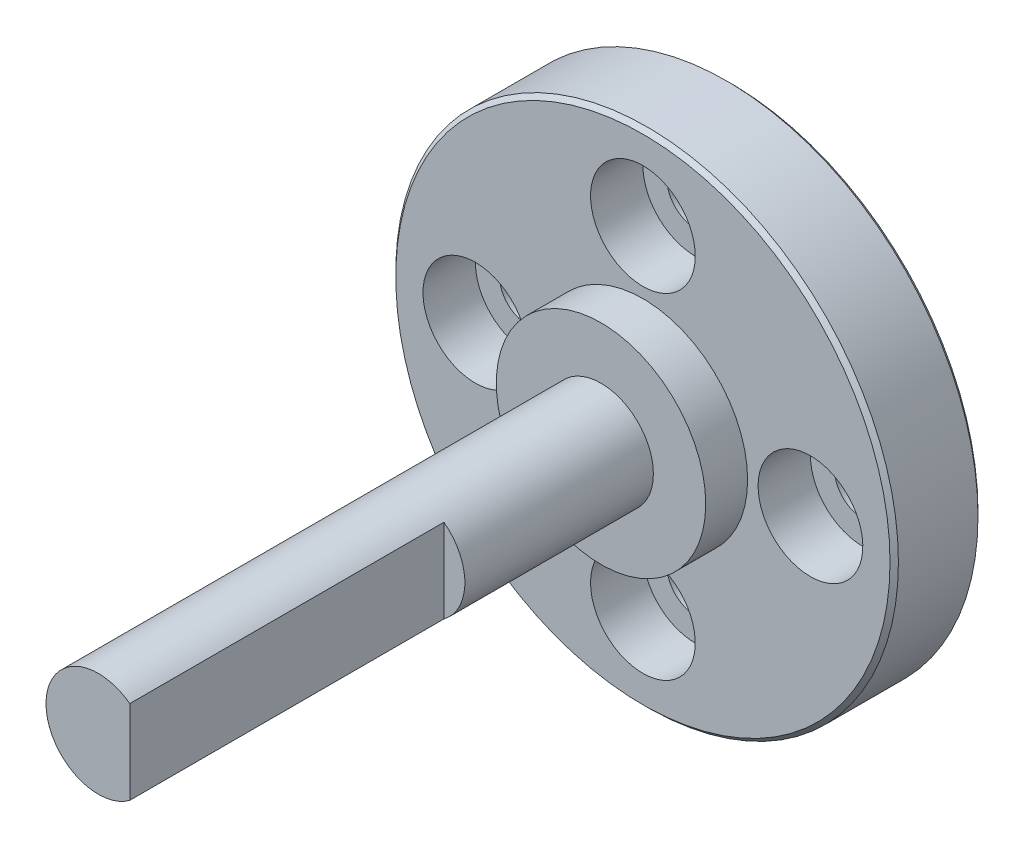
ISO-10303-21;
HEADER;
FILE_DESCRIPTION(('STEP AP214'),'2;1');
FILE_NAME('part.step','',(''),(''),'','','');
FILE_SCHEMA(('AUTOMOTIVE_DESIGN { 1 0 10303 214 1 1 1 1 }'));
ENDSEC;
DATA;
#1=APPLICATION_CONTEXT('core data for automotive mechanical design processes');
#2=APPLICATION_PROTOCOL_DEFINITION('international standard','automotive_design',2000,#1);
#3=PRODUCT_CONTEXT('',#1,'mechanical');
#4=PRODUCT('Part','Part','',(#3));
#5=PRODUCT_RELATED_PRODUCT_CATEGORY('part','',(#4));
#6=PRODUCT_DEFINITION_FORMATION('','',#4);
#7=PRODUCT_DEFINITION_CONTEXT('part definition',#1,'design');
#8=PRODUCT_DEFINITION('design','',#6,#7);
#9=PRODUCT_DEFINITION_SHAPE('','',#8);
#10=(LENGTH_UNIT() NAMED_UNIT(*) SI_UNIT(.MILLI.,.METRE.));
#11=(NAMED_UNIT(*) PLANE_ANGLE_UNIT() SI_UNIT($,.RADIAN.));
#12=(NAMED_UNIT(*) SI_UNIT($,.STERADIAN.) SOLID_ANGLE_UNIT());
#13=UNCERTAINTY_MEASURE_WITH_UNIT(LENGTH_MEASURE(1.E-05),#10,'distance_accuracy_value','');
#14=(GEOMETRIC_REPRESENTATION_CONTEXT(3) GLOBAL_UNCERTAINTY_ASSIGNED_CONTEXT((#13)) GLOBAL_UNIT_ASSIGNED_CONTEXT((#10,
#11,#12)) REPRESENTATION_CONTEXT('',''));
#15=CARTESIAN_POINT('',(0.,0.,0.));
#16=DIRECTION('',(0.,0.,1.));
#17=DIRECTION('',(1.,0.,0.));
#18=AXIS2_PLACEMENT_3D('',#15,#16,#17);
#19=CARTESIAN_POINT('',(0.,0.,4.2));
#20=DIRECTION('',(0.,0.,-1.));
#21=DIRECTION('',(-1.,0.,0.));
#22=AXIS2_PLACEMENT_3D('',#19,#20,#21);
#23=CYLINDRICAL_SURFACE('',#22,12.);
#24=CARTESIAN_POINT('',(0.,0.,0.199999999999999));
#25=DIRECTION('',(0.,0.,1.));
#26=DIRECTION('',(1.,0.,0.));
#27=AXIS2_PLACEMENT_3D('',#24,#25,#26);
#28=CIRCLE('',#27,12.);
#29=CARTESIAN_POINT('',(12.,0.,0.199999999999999));
#30=VERTEX_POINT('',#29);
#31=EDGE_CURVE('E174',#30,#30,#28,.T.);
#32=ORIENTED_EDGE('',*,*,#31,.T.);
#33=EDGE_LOOP('',(#32));
#34=FACE_BOUND('',#33,.T.);
#35=CARTESIAN_POINT('',(0.,0.,3.99999999999999));
#36=DIRECTION('',(0.,0.,1.));
#37=DIRECTION('',(1.,0.,0.));
#38=AXIS2_PLACEMENT_3D('',#35,#36,#37);
#39=CIRCLE('',#38,12.);
#40=CARTESIAN_POINT('',(12.,0.,3.99999999999999));
#41=VERTEX_POINT('',#40);
#42=EDGE_CURVE('E170',#41,#41,#39,.F.);
#43=ORIENTED_EDGE('',*,*,#42,.T.);
#44=EDGE_LOOP('',(#43));
#45=FACE_BOUND('',#44,.T.);
#46=ADVANCED_FACE('F47',(#34,#45),#23,.T.);
#47=CARTESIAN_POINT('',(0.,0.,4.2));
#48=DIRECTION('',(0.,0.,1.));
#49=DIRECTION('',(1.,0.,0.));
#50=AXIS2_PLACEMENT_3D('',#47,#48,#49);
#51=PLANE('',#50);
#52=CARTESIAN_POINT('',(0.,0.,4.2));
#53=DIRECTION('',(0.,0.,1.));
#54=DIRECTION('',(1.,0.,0.));
#55=AXIS2_PLACEMENT_3D('',#52,#53,#54);
#56=CIRCLE('',#55,11.8);
#57=CARTESIAN_POINT('',(11.8,0.,4.2));
#58=VERTEX_POINT('',#57);
#59=EDGE_CURVE('E11',#58,#58,#56,.T.);
#60=ORIENTED_EDGE('',*,*,#59,.T.);
#61=EDGE_LOOP('',(#60));
#62=FACE_BOUND('',#61,.T.);
#63=CARTESIAN_POINT('',(8.,0.,4.2));
#64=DIRECTION('',(0.,0.,1.));
#65=DIRECTION('',(0.,-1.,0.));
#66=AXIS2_PLACEMENT_3D('',#63,#64,#65);
#67=CIRCLE('',#66,2.5);
#68=CARTESIAN_POINT('',(7.99999999999999,-2.50000000000003,4.2));
#69=VERTEX_POINT('',#68);
#70=EDGE_CURVE('E99',#69,#69,#67,.T.);
#71=ORIENTED_EDGE('',*,*,#70,.F.);
#72=EDGE_LOOP('',(#71));
#73=FACE_BOUND('',#72,.T.);
#74=CARTESIAN_POINT('',(0.,-8.,4.2));
#75=DIRECTION('',(0.,0.,1.));
#76=DIRECTION('',(-1.,0.,0.));
#77=AXIS2_PLACEMENT_3D('',#74,#75,#76);
#78=CIRCLE('',#77,2.5);
#79=CARTESIAN_POINT('',(-2.5,-8.,4.2));
#80=VERTEX_POINT('',#79);
#81=EDGE_CURVE('E117',#80,#80,#78,.T.);
#82=ORIENTED_EDGE('',*,*,#81,.F.);
#83=EDGE_LOOP('',(#82));
#84=FACE_BOUND('',#83,.T.);
#85=CARTESIAN_POINT('',(-8.,0.,4.2));
#86=DIRECTION('',(0.,0.,1.));
#87=DIRECTION('',(0.,1.,0.));
#88=AXIS2_PLACEMENT_3D('',#85,#86,#87);
#89=CIRCLE('',#88,2.5);
#90=CARTESIAN_POINT('',(-7.99999999999997,2.50000000000008,4.2));
#91=VERTEX_POINT('',#90);
#92=EDGE_CURVE('E96',#91,#91,#89,.T.);
#93=ORIENTED_EDGE('',*,*,#92,.F.);
#94=EDGE_LOOP('',(#93));
#95=FACE_BOUND('',#94,.T.);
#96=CARTESIAN_POINT('',(0.,8.,4.2));
#97=DIRECTION('',(0.,0.,1.));
#98=DIRECTION('',(1.,0.,0.));
#99=AXIS2_PLACEMENT_3D('',#96,#97,#98);
#100=CIRCLE('',#99,2.5);
#101=CARTESIAN_POINT('',(2.5,8.,4.2));
#102=VERTEX_POINT('',#101);
#103=EDGE_CURVE('E116',#102,#102,#100,.T.);
#104=ORIENTED_EDGE('',*,*,#103,.F.);
#105=EDGE_LOOP('',(#104));
#106=FACE_BOUND('',#105,.T.);
#107=CARTESIAN_POINT('',(0.,0.,4.2));
#108=DIRECTION('',(0.,0.,1.));
#109=DIRECTION('',(1.,0.,0.));
#110=AXIS2_PLACEMENT_3D('',#107,#108,#109);
#111=CIRCLE('',#110,5.);
#112=CARTESIAN_POINT('',(5.,0.,4.2));
#113=VERTEX_POINT('',#112);
#114=EDGE_CURVE('E166',#113,#113,#111,.T.);
#115=ORIENTED_EDGE('',*,*,#114,.F.);
#116=EDGE_LOOP('',(#115));
#117=FACE_BOUND('',#116,.T.);
#118=ADVANCED_FACE('F193',(#62,#73,#84,#95,#106,#117),#51,.T.);
#119=CARTESIAN_POINT('',(0.,0.,0.));
#120=DIRECTION('',(0.,0.,1.));
#121=DIRECTION('',(1.,0.,0.));
#122=AXIS2_PLACEMENT_3D('',#119,#120,#121);
#123=PLANE('',#122);
#124=CARTESIAN_POINT('',(0.,0.,0.));
#125=DIRECTION('',(0.,0.,1.));
#126=DIRECTION('',(1.,0.,0.));
#127=AXIS2_PLACEMENT_3D('',#124,#125,#126);
#128=CIRCLE('',#127,11.8);
#129=CARTESIAN_POINT('',(11.8,0.,0.));
#130=VERTEX_POINT('',#129);
#131=EDGE_CURVE('E58',#130,#130,#128,.F.);
#132=ORIENTED_EDGE('',*,*,#131,.T.);
#133=EDGE_LOOP('',(#132));
#134=FACE_BOUND('',#133,.T.);
#135=CARTESIAN_POINT('',(8.,0.,0.));
#136=DIRECTION('',(0.,0.,1.));
#137=DIRECTION('',(0.,-1.,0.));
#138=AXIS2_PLACEMENT_3D('',#135,#136,#137);
#139=CIRCLE('',#138,1.35);
#140=CARTESIAN_POINT('',(7.99999999999999,-1.35000000000003,0.));
#141=VERTEX_POINT('',#140);
#142=EDGE_CURVE('E103',#141,#141,#139,.T.);
#143=ORIENTED_EDGE('',*,*,#142,.T.);
#144=EDGE_LOOP('',(#143));
#145=FACE_BOUND('',#144,.T.);
#146=CARTESIAN_POINT('',(0.,-8.,0.));
#147=DIRECTION('',(0.,0.,1.));
#148=DIRECTION('',(-1.,0.,0.));
#149=AXIS2_PLACEMENT_3D('',#146,#147,#148);
#150=CIRCLE('',#149,1.35);
#151=CARTESIAN_POINT('',(-1.35,-8.,0.));
#152=VERTEX_POINT('',#151);
#153=EDGE_CURVE('E121',#152,#152,#150,.T.);
#154=ORIENTED_EDGE('',*,*,#153,.T.);
#155=EDGE_LOOP('',(#154));
#156=FACE_BOUND('',#155,.T.);
#157=CARTESIAN_POINT('',(-8.,0.,0.));
#158=DIRECTION('',(0.,0.,1.));
#159=DIRECTION('',(0.,1.,0.));
#160=AXIS2_PLACEMENT_3D('',#157,#158,#159);
#161=CIRCLE('',#160,1.35);
#162=CARTESIAN_POINT('',(-7.99999999999999,1.35000000000008,0.));
#163=VERTEX_POINT('',#162);
#164=EDGE_CURVE('E136',#163,#163,#161,.T.);
#165=ORIENTED_EDGE('',*,*,#164,.T.);
#166=EDGE_LOOP('',(#165));
#167=FACE_BOUND('',#166,.T.);
#168=CARTESIAN_POINT('',(0.,8.,0.));
#169=DIRECTION('',(0.,0.,1.));
#170=DIRECTION('',(1.,0.,0.));
#171=AXIS2_PLACEMENT_3D('',#168,#169,#170);
#172=CIRCLE('',#171,1.35);
#173=CARTESIAN_POINT('',(1.35,8.,0.));
#174=VERTEX_POINT('',#173);
#175=EDGE_CURVE('E158',#174,#174,#172,.T.);
#176=ORIENTED_EDGE('',*,*,#175,.T.);
#177=EDGE_LOOP('',(#176));
#178=FACE_BOUND('',#177,.T.);
#179=ADVANCED_FACE('F182',(#134,#145,#156,#167,#178),#123,.F.);
#180=CARTESIAN_POINT('',(0.,0.,6.2));
#181=DIRECTION('',(0.,0.,-1.));
#182=DIRECTION('',(-1.,0.,0.));
#183=AXIS2_PLACEMENT_3D('',#180,#181,#182);
#184=CYLINDRICAL_SURFACE('',#183,5.);
#185=CARTESIAN_POINT('',(0.,0.,6.2));
#186=DIRECTION('',(0.,0.,1.));
#187=DIRECTION('',(1.,0.,0.));
#188=AXIS2_PLACEMENT_3D('',#185,#186,#187);
#189=CIRCLE('',#188,5.);
#190=CARTESIAN_POINT('',(5.,0.,6.2));
#191=VERTEX_POINT('',#190);
#192=EDGE_CURVE('E162',#191,#191,#189,.T.);
#193=ORIENTED_EDGE('',*,*,#192,.F.);
#194=EDGE_LOOP('',(#193));
#195=FACE_BOUND('',#194,.T.);
#196=ORIENTED_EDGE('',*,*,#114,.T.);
#197=EDGE_LOOP('',(#196));
#198=FACE_BOUND('',#197,.T.);
#199=ADVANCED_FACE('F214',(#195,#198),#184,.T.);
#200=CARTESIAN_POINT('',(0.,0.,6.2));
#201=DIRECTION('',(0.,0.,1.));
#202=DIRECTION('',(1.,0.,0.));
#203=AXIS2_PLACEMENT_3D('',#200,#201,#202);
#204=PLANE('',#203);
#205=CARTESIAN_POINT('',(0.,0.,6.2));
#206=DIRECTION('',(0.,0.,1.));
#207=DIRECTION('',(1.,0.,0.));
#208=AXIS2_PLACEMENT_3D('',#205,#206,#207);
#209=CIRCLE('',#208,2.5);
#210=CARTESIAN_POINT('',(2.5,0.,6.2));
#211=VERTEX_POINT('',#210);
#212=EDGE_CURVE('E52',#211,#211,#209,.F.);
#213=ORIENTED_EDGE('',*,*,#212,.T.);
#214=EDGE_LOOP('',(#213));
#215=FACE_BOUND('',#214,.T.);
#216=ORIENTED_EDGE('',*,*,#192,.T.);
#217=EDGE_LOOP('',(#216));
#218=FACE_BOUND('',#217,.T.);
#219=ADVANCED_FACE('F216',(#215,#218),#204,.T.);
#220=CARTESIAN_POINT('',(0.,8.,4.2));
#221=DIRECTION('',(0.,0.,1.));
#222=DIRECTION('',(1.,0.,0.));
#223=AXIS2_PLACEMENT_3D('',#220,#221,#222);
#224=CYLINDRICAL_SURFACE('',#223,1.35);
#225=ORIENTED_EDGE('',*,*,#175,.F.);
#226=EDGE_LOOP('',(#225));
#227=FACE_BOUND('',#226,.T.);
#228=CARTESIAN_POINT('',(0.,8.,1.7));
#229=DIRECTION('',(0.,0.,1.));
#230=DIRECTION('',(1.,0.,0.));
#231=AXIS2_PLACEMENT_3D('',#228,#229,#230);
#232=CIRCLE('',#231,1.35);
#233=CARTESIAN_POINT('',(1.35,8.,1.7));
#234=VERTEX_POINT('',#233);
#235=EDGE_CURVE('E154',#234,#234,#232,.T.);
#236=ORIENTED_EDGE('',*,*,#235,.T.);
#237=EDGE_LOOP('',(#236));
#238=FACE_BOUND('',#237,.T.);
#239=ADVANCED_FACE('F223',(#227,#238),#224,.F.);
#240=CARTESIAN_POINT('',(1.35,8.,1.7));
#241=DIRECTION('',(0.,0.,-1.));
#242=DIRECTION('',(-1.,0.,0.));
#243=AXIS2_PLACEMENT_3D('',#240,#241,#242);
#244=PLANE('',#243);
#245=ORIENTED_EDGE('',*,*,#235,.F.);
#246=EDGE_LOOP('',(#245));
#247=FACE_BOUND('',#246,.T.);
#248=CARTESIAN_POINT('',(0.,8.,1.7));
#249=DIRECTION('',(0.,0.,1.));
#250=DIRECTION('',(1.,0.,0.));
#251=AXIS2_PLACEMENT_3D('',#248,#249,#250);
#252=CIRCLE('',#251,2.5);
#253=CARTESIAN_POINT('',(2.5,8.,1.7));
#254=VERTEX_POINT('',#253);
#255=EDGE_CURVE('E150',#254,#254,#252,.T.);
#256=ORIENTED_EDGE('',*,*,#255,.T.);
#257=EDGE_LOOP('',(#256));
#258=FACE_BOUND('',#257,.T.);
#259=ADVANCED_FACE('F236',(#247,#258),#244,.F.);
#260=CARTESIAN_POINT('',(0.,8.,4.2));
#261=DIRECTION('',(0.,0.,1.));
#262=DIRECTION('',(1.,0.,0.));
#263=AXIS2_PLACEMENT_3D('',#260,#261,#262);
#264=CYLINDRICAL_SURFACE('',#263,2.5);
#265=ORIENTED_EDGE('',*,*,#255,.F.);
#266=EDGE_LOOP('',(#265));
#267=FACE_BOUND('',#266,.T.);
#268=ORIENTED_EDGE('',*,*,#103,.T.);
#269=EDGE_LOOP('',(#268));
#270=FACE_BOUND('',#269,.T.);
#271=ADVANCED_FACE('F240',(#267,#270),#264,.F.);
#272=CARTESIAN_POINT('',(-8.,0.,4.2));
#273=DIRECTION('',(0.,0.,1.));
#274=DIRECTION('',(0.,1.,0.));
#275=AXIS2_PLACEMENT_3D('',#272,#273,#274);
#276=CYLINDRICAL_SURFACE('',#275,1.35);
#277=ORIENTED_EDGE('',*,*,#164,.F.);
#278=EDGE_LOOP('',(#277));
#279=FACE_BOUND('',#278,.T.);
#280=CARTESIAN_POINT('',(-8.,0.,1.7));
#281=DIRECTION('',(0.,0.,1.));
#282=DIRECTION('',(0.,1.,0.));
#283=AXIS2_PLACEMENT_3D('',#280,#281,#282);
#284=CIRCLE('',#283,1.35);
#285=CARTESIAN_POINT('',(-7.99999999999999,1.35000000000008,1.7));
#286=VERTEX_POINT('',#285);
#287=EDGE_CURVE('E122',#286,#286,#284,.T.);
#288=ORIENTED_EDGE('',*,*,#287,.T.);
#289=EDGE_LOOP('',(#288));
#290=FACE_BOUND('',#289,.T.);
#291=ADVANCED_FACE('F244',(#279,#290),#276,.F.);
#292=CARTESIAN_POINT('',(-7.99999999999999,1.35000000000008,1.7));
#293=DIRECTION('',(0.,0.,-1.));
#294=DIRECTION('',(0.,-1.,0.));
#295=AXIS2_PLACEMENT_3D('',#292,#293,#294);
#296=PLANE('',#295);
#297=ORIENTED_EDGE('',*,*,#287,.F.);
#298=EDGE_LOOP('',(#297));
#299=FACE_BOUND('',#298,.T.);
#300=CARTESIAN_POINT('',(-8.,0.,1.7));
#301=DIRECTION('',(0.,0.,1.));
#302=DIRECTION('',(0.,1.,0.));
#303=AXIS2_PLACEMENT_3D('',#300,#301,#302);
#304=CIRCLE('',#303,2.5);
#305=CARTESIAN_POINT('',(-7.99999999999997,2.50000000000008,1.7));
#306=VERTEX_POINT('',#305);
#307=EDGE_CURVE('E140',#306,#306,#304,.T.);
#308=ORIENTED_EDGE('',*,*,#307,.T.);
#309=EDGE_LOOP('',(#308));
#310=FACE_BOUND('',#309,.T.);
#311=ADVANCED_FACE('F248',(#299,#310),#296,.F.);
#312=CARTESIAN_POINT('',(-8.,0.,4.2));
#313=DIRECTION('',(0.,0.,1.));
#314=DIRECTION('',(0.,1.,0.));
#315=AXIS2_PLACEMENT_3D('',#312,#313,#314);
#316=CYLINDRICAL_SURFACE('',#315,2.5);
#317=ORIENTED_EDGE('',*,*,#307,.F.);
#318=EDGE_LOOP('',(#317));
#319=FACE_BOUND('',#318,.T.);
#320=ORIENTED_EDGE('',*,*,#92,.T.);
#321=EDGE_LOOP('',(#320));
#322=FACE_BOUND('',#321,.T.);
#323=ADVANCED_FACE('F252',(#319,#322),#316,.F.);
#324=CARTESIAN_POINT('',(0.,-8.,4.2));
#325=DIRECTION('',(0.,0.,1.));
#326=DIRECTION('',(-1.,0.,0.));
#327=AXIS2_PLACEMENT_3D('',#324,#325,#326);
#328=CYLINDRICAL_SURFACE('',#327,1.35);
#329=ORIENTED_EDGE('',*,*,#153,.F.);
#330=EDGE_LOOP('',(#329));
#331=FACE_BOUND('',#330,.T.);
#332=CARTESIAN_POINT('',(0.,-8.,1.7));
#333=DIRECTION('',(0.,0.,1.));
#334=DIRECTION('',(-1.,0.,0.));
#335=AXIS2_PLACEMENT_3D('',#332,#333,#334);
#336=CIRCLE('',#335,1.35);
#337=CARTESIAN_POINT('',(-1.35,-8.,1.7));
#338=VERTEX_POINT('',#337);
#339=EDGE_CURVE('E104',#338,#338,#336,.T.);
#340=ORIENTED_EDGE('',*,*,#339,.T.);
#341=EDGE_LOOP('',(#340));
#342=FACE_BOUND('',#341,.T.);
#343=ADVANCED_FACE('F256',(#331,#342),#328,.F.);
#344=CARTESIAN_POINT('',(-1.35,-8.,1.7));
#345=DIRECTION('',(0.,0.,-1.));
#346=DIRECTION('',(1.,0.,0.));
#347=AXIS2_PLACEMENT_3D('',#344,#345,#346);
#348=PLANE('',#347);
#349=ORIENTED_EDGE('',*,*,#339,.F.);
#350=EDGE_LOOP('',(#349));
#351=FACE_BOUND('',#350,.T.);
#352=CARTESIAN_POINT('',(0.,-8.,1.7));
#353=DIRECTION('',(0.,0.,1.));
#354=DIRECTION('',(-1.,0.,0.));
#355=AXIS2_PLACEMENT_3D('',#352,#353,#354);
#356=CIRCLE('',#355,2.5);
#357=CARTESIAN_POINT('',(-2.5,-8.,1.7));
#358=VERTEX_POINT('',#357);
#359=EDGE_CURVE('E126',#358,#358,#356,.T.);
#360=ORIENTED_EDGE('',*,*,#359,.T.);
#361=EDGE_LOOP('',(#360));
#362=FACE_BOUND('',#361,.T.);
#363=ADVANCED_FACE('F260',(#351,#362),#348,.F.);
#364=CARTESIAN_POINT('',(0.,-8.,4.2));
#365=DIRECTION('',(0.,0.,1.));
#366=DIRECTION('',(-1.,0.,0.));
#367=AXIS2_PLACEMENT_3D('',#364,#365,#366);
#368=CYLINDRICAL_SURFACE('',#367,2.5);
#369=ORIENTED_EDGE('',*,*,#359,.F.);
#370=EDGE_LOOP('',(#369));
#371=FACE_BOUND('',#370,.T.);
#372=ORIENTED_EDGE('',*,*,#81,.T.);
#373=EDGE_LOOP('',(#372));
#374=FACE_BOUND('',#373,.T.);
#375=ADVANCED_FACE('F264',(#371,#374),#368,.F.);
#376=CARTESIAN_POINT('',(8.,0.,4.2));
#377=DIRECTION('',(0.,0.,1.));
#378=DIRECTION('',(0.,-1.,0.));
#379=AXIS2_PLACEMENT_3D('',#376,#377,#378);
#380=CYLINDRICAL_SURFACE('',#379,1.35);
#381=ORIENTED_EDGE('',*,*,#142,.F.);
#382=EDGE_LOOP('',(#381));
#383=FACE_BOUND('',#382,.T.);
#384=CARTESIAN_POINT('',(8.,0.,1.7));
#385=DIRECTION('',(0.,0.,1.));
#386=DIRECTION('',(0.,-1.,0.));
#387=AXIS2_PLACEMENT_3D('',#384,#385,#386);
#388=CIRCLE('',#387,1.35);
#389=CARTESIAN_POINT('',(7.99999999999999,-1.35000000000003,1.7));
#390=VERTEX_POINT('',#389);
#391=EDGE_CURVE('E112',#390,#390,#388,.T.);
#392=ORIENTED_EDGE('',*,*,#391,.T.);
#393=EDGE_LOOP('',(#392));
#394=FACE_BOUND('',#393,.T.);
#395=ADVANCED_FACE('F268',(#383,#394),#380,.F.);
#396=CARTESIAN_POINT('',(7.99999999999999,-1.35000000000003,1.7));
#397=DIRECTION('',(0.,0.,-1.));
#398=DIRECTION('',(0.,1.,0.));
#399=AXIS2_PLACEMENT_3D('',#396,#397,#398);
#400=PLANE('',#399);
#401=ORIENTED_EDGE('',*,*,#391,.F.);
#402=EDGE_LOOP('',(#401));
#403=FACE_BOUND('',#402,.T.);
#404=CARTESIAN_POINT('',(8.,0.,1.7));
#405=DIRECTION('',(0.,0.,1.));
#406=DIRECTION('',(0.,-1.,0.));
#407=AXIS2_PLACEMENT_3D('',#404,#405,#406);
#408=CIRCLE('',#407,2.5);
#409=CARTESIAN_POINT('',(7.99999999999999,-2.50000000000003,1.7));
#410=VERTEX_POINT('',#409);
#411=EDGE_CURVE('E108',#410,#410,#408,.T.);
#412=ORIENTED_EDGE('',*,*,#411,.T.);
#413=EDGE_LOOP('',(#412));
#414=FACE_BOUND('',#413,.T.);
#415=ADVANCED_FACE('F272',(#403,#414),#400,.F.);
#416=CARTESIAN_POINT('',(8.,0.,4.2));
#417=DIRECTION('',(0.,0.,1.));
#418=DIRECTION('',(0.,-1.,0.));
#419=AXIS2_PLACEMENT_3D('',#416,#417,#418);
#420=CYLINDRICAL_SURFACE('',#419,2.5);
#421=ORIENTED_EDGE('',*,*,#411,.F.);
#422=EDGE_LOOP('',(#421));
#423=FACE_BOUND('',#422,.T.);
#424=ORIENTED_EDGE('',*,*,#70,.T.);
#425=EDGE_LOOP('',(#424));
#426=FACE_BOUND('',#425,.T.);
#427=ADVANCED_FACE('F188',(#423,#426),#420,.F.);
#428=CARTESIAN_POINT('',(0.,0.,0.199999999999999));
#429=DIRECTION('',(0.,0.,1.));
#430=DIRECTION('',(1.,0.,0.));
#431=AXIS2_PLACEMENT_3D('',#428,#429,#430);
#432=CONICAL_SURFACE('',#431,12.,0.785398163397448);
#433=ORIENTED_EDGE('',*,*,#131,.F.);
#434=EDGE_LOOP('',(#433));
#435=FACE_BOUND('',#434,.T.);
#436=ORIENTED_EDGE('',*,*,#31,.F.);
#437=EDGE_LOOP('',(#436));
#438=FACE_BOUND('',#437,.T.);
#439=ADVANCED_FACE('F185',(#435,#438),#432,.T.);
#440=CARTESIAN_POINT('',(0.,0.,4.2));
#441=DIRECTION('',(0.,0.,-1.));
#442=DIRECTION('',(-1.,0.,0.));
#443=AXIS2_PLACEMENT_3D('',#440,#441,#442);
#444=CONICAL_SURFACE('',#443,11.8,0.785398163397453);
#445=ORIENTED_EDGE('',*,*,#42,.F.);
#446=EDGE_LOOP('',(#445));
#447=FACE_BOUND('',#446,.T.);
#448=ORIENTED_EDGE('',*,*,#59,.F.);
#449=EDGE_LOOP('',(#448));
#450=FACE_BOUND('',#449,.T.);
#451=ADVANCED_FACE('F50',(#447,#450),#444,.T.);
#452=CARTESIAN_POINT('',(0.,0.,30.2));
#453=DIRECTION('',(0.,0.,-1.));
#454=DIRECTION('',(-1.,0.,0.));
#455=AXIS2_PLACEMENT_3D('',#452,#453,#454);
#456=CYLINDRICAL_SURFACE('',#455,2.5);
#457=CARTESIAN_POINT('',(0.,0.,30.2));
#458=DIRECTION('',(0.,0.,1.));
#459=DIRECTION('',(1.,0.,0.));
#460=AXIS2_PLACEMENT_3D('',#457,#458,#459);
#461=CIRCLE('',#460,2.5);
#462=CARTESIAN_POINT('',(1.5,2.,30.2));
#463=VERTEX_POINT('',#462);
#464=CARTESIAN_POINT('',(1.5,-2.,30.2));
#465=VERTEX_POINT('',#464);
#466=EDGE_CURVE('E88',#463,#465,#461,.T.);
#467=ORIENTED_EDGE('',*,*,#466,.F.);
#468=DIRECTION('',(0.,0.,1.));
#469=VECTOR('',#468,1.);
#470=CARTESIAN_POINT('',(1.5,2.,15.2));
#471=LINE('',#470,#469);
#472=CARTESIAN_POINT('',(1.5,2.,15.2));
#473=VERTEX_POINT('',#472);
#474=EDGE_CURVE('E65',#473,#463,#471,.T.);
#475=ORIENTED_EDGE('',*,*,#474,.F.);
#476=CARTESIAN_POINT('',(0.,0.,15.2));
#477=DIRECTION('',(0.,0.,1.));
#478=DIRECTION('',(1.,0.,0.));
#479=AXIS2_PLACEMENT_3D('',#476,#477,#478);
#480=CIRCLE('',#479,2.5);
#481=CARTESIAN_POINT('',(1.5,-2.,15.2));
#482=VERTEX_POINT('',#481);
#483=EDGE_CURVE('E82',#482,#473,#480,.T.);
#484=ORIENTED_EDGE('',*,*,#483,.F.);
#485=DIRECTION('',(0.,0.,1.));
#486=VECTOR('',#485,1.);
#487=CARTESIAN_POINT('',(1.5,-2.,15.2));
#488=LINE('',#487,#486);
#489=EDGE_CURVE('E71',#482,#465,#488,.T.);
#490=ORIENTED_EDGE('',*,*,#489,.T.);
#491=EDGE_LOOP('',(#467,#475,#484,#490));
#492=FACE_BOUND('',#491,.T.);
#493=ORIENTED_EDGE('',*,*,#212,.F.);
#494=EDGE_LOOP('',(#493));
#495=FACE_BOUND('',#494,.T.);
#496=ADVANCED_FACE('F86',(#492,#495),#456,.T.);
#497=CARTESIAN_POINT('',(0.,0.,30.2));
#498=DIRECTION('',(0.,0.,1.));
#499=DIRECTION('',(1.,0.,0.));
#500=AXIS2_PLACEMENT_3D('',#497,#498,#499);
#501=PLANE('',#500);
#502=DIRECTION('',(0.,-1.,0.));
#503=VECTOR('',#502,1.);
#504=CARTESIAN_POINT('',(1.5,0.,30.2));
#505=LINE('',#504,#503);
#506=EDGE_CURVE('E76',#463,#465,#505,.T.);
#507=ORIENTED_EDGE('',*,*,#506,.F.);
#508=ORIENTED_EDGE('',*,*,#466,.T.);
#509=EDGE_LOOP('',(#507,#508));
#510=FACE_BOUND('',#509,.T.);
#511=ADVANCED_FACE('F91',(#510),#501,.T.);
#512=CARTESIAN_POINT('',(1.5,0.,15.2));
#513=DIRECTION('',(-1.,0.,0.));
#514=DIRECTION('',(0.,0.,1.));
#515=AXIS2_PLACEMENT_3D('',#512,#513,#514);
#516=PLANE('',#515);
#517=ORIENTED_EDGE('',*,*,#506,.T.);
#518=ORIENTED_EDGE('',*,*,#489,.F.);
#519=DIRECTION('',(0.,-1.,0.));
#520=VECTOR('',#519,1.);
#521=CARTESIAN_POINT('',(1.5,0.,15.2));
#522=LINE('',#521,#520);
#523=EDGE_CURVE('E291',#473,#482,#522,.T.);
#524=ORIENTED_EDGE('',*,*,#523,.F.);
#525=ORIENTED_EDGE('',*,*,#474,.T.);
#526=EDGE_LOOP('',(#517,#518,#524,#525));
#527=FACE_BOUND('',#526,.T.);
#528=ADVANCED_FACE('F77',(#527),#516,.F.);
#529=CARTESIAN_POINT('',(0.,0.,15.2));
#530=DIRECTION('',(0.,0.,1.));
#531=DIRECTION('',(1.,0.,0.));
#532=AXIS2_PLACEMENT_3D('',#529,#530,#531);
#533=PLANE('',#532);
#534=ORIENTED_EDGE('',*,*,#483,.T.);
#535=ORIENTED_EDGE('',*,*,#523,.T.);
#536=EDGE_LOOP('',(#534,#535));
#537=FACE_BOUND('',#536,.T.);
#538=ADVANCED_FACE('F286',(#537),#533,.T.);
#539=CLOSED_SHELL('',(#46,#118,#179,#199,#219,#239,#259,#271,#291,#311,#323,#343,#363,#375,#395,
#415,#427,#439,#451,#496,#511,#528,#538));
#540=MANIFOLD_SOLID_BREP('B2',#539);
#541=ADVANCED_BREP_SHAPE_REPRESENTATION('',(#18,#540),#14);
#542=SHAPE_DEFINITION_REPRESENTATION(#9,#541);
ENDSEC;
END-ISO-10303-21;
